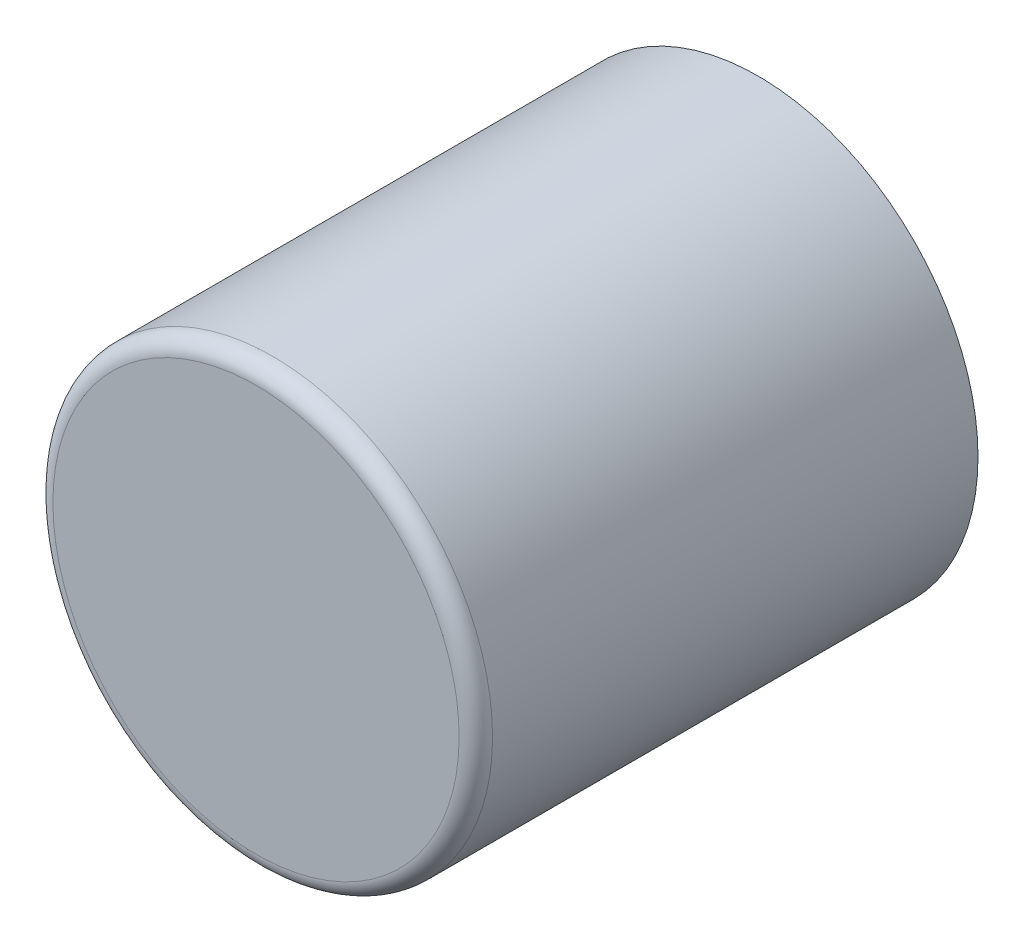
ISO-10303-21;
HEADER;
FILE_DESCRIPTION(('STEP AP214'),'2;1');
FILE_NAME('part.step','',(''),(''),'','','');
FILE_SCHEMA(('AUTOMOTIVE_DESIGN { 1 0 10303 214 1 1 1 1 }'));
ENDSEC;
DATA;
#1=APPLICATION_CONTEXT('core data for automotive mechanical design processes');
#2=APPLICATION_PROTOCOL_DEFINITION('international standard','automotive_design',2000,#1);
#3=PRODUCT_CONTEXT('',#1,'mechanical');
#4=PRODUCT('Part','Part','',(#3));
#5=PRODUCT_RELATED_PRODUCT_CATEGORY('part','',(#4));
#6=PRODUCT_DEFINITION_FORMATION('','',#4);
#7=PRODUCT_DEFINITION_CONTEXT('part definition',#1,'design');
#8=PRODUCT_DEFINITION('design','',#6,#7);
#9=PRODUCT_DEFINITION_SHAPE('','',#8);
#10=(LENGTH_UNIT() NAMED_UNIT(*) SI_UNIT(.MILLI.,.METRE.));
#11=(NAMED_UNIT(*) PLANE_ANGLE_UNIT() SI_UNIT($,.RADIAN.));
#12=(NAMED_UNIT(*) SI_UNIT($,.STERADIAN.) SOLID_ANGLE_UNIT());
#13=UNCERTAINTY_MEASURE_WITH_UNIT(LENGTH_MEASURE(1.E-05),#10,'distance_accuracy_value','');
#14=(GEOMETRIC_REPRESENTATION_CONTEXT(3) GLOBAL_UNCERTAINTY_ASSIGNED_CONTEXT((#13)) GLOBAL_UNIT_ASSIGNED_CONTEXT((#10,
#11,#12)) REPRESENTATION_CONTEXT('',''));
#15=CARTESIAN_POINT('',(0.,0.,0.));
#16=DIRECTION('',(0.,0.,1.));
#17=DIRECTION('',(1.,0.,0.));
#18=AXIS2_PLACEMENT_3D('',#15,#16,#17);
#19=CARTESIAN_POINT('',(0.,0.,10.061));
#20=DIRECTION('',(0.,0.,1.));
#21=DIRECTION('',(1.,0.,0.));
#22=AXIS2_PLACEMENT_3D('',#19,#20,#21);
#23=PLANE('',#22);
#24=CARTESIAN_POINT('',(0.,0.,10.061));
#25=DIRECTION('',(0.,0.,-1.));
#26=DIRECTION('',(-1.,0.,0.));
#27=AXIS2_PLACEMENT_3D('',#24,#25,#26);
#28=CIRCLE('',#27,3.642715);
#29=CARTESIAN_POINT('',(-3.642715,0.,10.061));
#30=VERTEX_POINT('',#29);
#31=CARTESIAN_POINT('',(3.642715,0.,10.061));
#32=VERTEX_POINT('',#31);
#33=EDGE_CURVE('E41',#30,#32,#28,.T.);
#34=ORIENTED_EDGE('',*,*,#33,.F.);
#35=CARTESIAN_POINT('',(0.,0.,10.061));
#36=DIRECTION('',(0.,0.,-1.));
#37=DIRECTION('',(1.,0.,0.));
#38=AXIS2_PLACEMENT_3D('',#35,#36,#37);
#39=CIRCLE('',#38,3.642715);
#40=EDGE_CURVE('E35',#32,#30,#39,.T.);
#41=ORIENTED_EDGE('',*,*,#40,.F.);
#42=EDGE_LOOP('',(#34,#41));
#43=FACE_BOUND('',#42,.T.);
#44=ADVANCED_FACE('F17',(#43),#23,.T.);
#45=CARTESIAN_POINT('',(0.,0.,1.054));
#46=DIRECTION('',(0.,0.,1.));
#47=DIRECTION('',(1.,0.,0.));
#48=AXIS2_PLACEMENT_3D('',#45,#46,#47);
#49=PLANE('',#48);
#50=CARTESIAN_POINT('',(0.,0.,1.054));
#51=DIRECTION('',(0.,0.,1.));
#52=DIRECTION('',(1.,0.,0.));
#53=AXIS2_PLACEMENT_3D('',#50,#51,#52);
#54=CIRCLE('',#53,3.942715);
#55=CARTESIAN_POINT('',(3.942715,0.,1.054));
#56=VERTEX_POINT('',#55);
#57=EDGE_CURVE('E28',#56,#56,#54,.T.);
#58=ORIENTED_EDGE('',*,*,#57,.F.);
#59=EDGE_LOOP('',(#58));
#60=FACE_BOUND('',#59,.T.);
#61=ADVANCED_FACE('F75',(#60),#49,.F.);
#62=CARTESIAN_POINT('',(0.,0.,9.761));
#63=DIRECTION('',(0.,0.,1.));
#64=DIRECTION('',(1.,0.,0.));
#65=AXIS2_PLACEMENT_3D('',#62,#63,#64);
#66=TOROIDAL_SURFACE('',#65,3.642715,0.3);
#67=ORIENTED_EDGE('',*,*,#40,.T.);
#68=ORIENTED_EDGE('',*,*,#33,.T.);
#69=EDGE_LOOP('',(#67,#68));
#70=FACE_BOUND('',#69,.T.);
#71=CARTESIAN_POINT('',(0.,0.,9.761));
#72=DIRECTION('',(0.,0.,1.));
#73=DIRECTION('',(1.,0.,0.));
#74=AXIS2_PLACEMENT_3D('',#71,#72,#73);
#75=CIRCLE('',#74,3.942715);
#76=CARTESIAN_POINT('',(3.942715,0.,9.761));
#77=VERTEX_POINT('',#76);
#78=EDGE_CURVE('E11',#77,#77,#75,.F.);
#79=ORIENTED_EDGE('',*,*,#78,.F.);
#80=EDGE_LOOP('',(#79));
#81=FACE_BOUND('',#80,.T.);
#82=ADVANCED_FACE('F39',(#70,#81),#66,.T.);
#83=CARTESIAN_POINT('',(0.,0.,1.054));
#84=DIRECTION('',(0.,0.,1.));
#85=DIRECTION('',(1.,0.,0.));
#86=AXIS2_PLACEMENT_3D('',#83,#84,#85);
#87=CYLINDRICAL_SURFACE('',#86,3.942715);
#88=ORIENTED_EDGE('',*,*,#78,.T.);
#89=EDGE_LOOP('',(#88));
#90=FACE_BOUND('',#89,.T.);
#91=ORIENTED_EDGE('',*,*,#57,.T.);
#92=EDGE_LOOP('',(#91));
#93=FACE_BOUND('',#92,.T.);
#94=ADVANCED_FACE('F74',(#90,#93),#87,.T.);
#95=CLOSED_SHELL('',(#44,#61,#82,#94));
#96=MANIFOLD_SOLID_BREP('B1',#95);
#97=ADVANCED_BREP_SHAPE_REPRESENTATION('',(#18,#96),#14);
#98=SHAPE_DEFINITION_REPRESENTATION(#9,#97);
ENDSEC;
END-ISO-10303-21;
